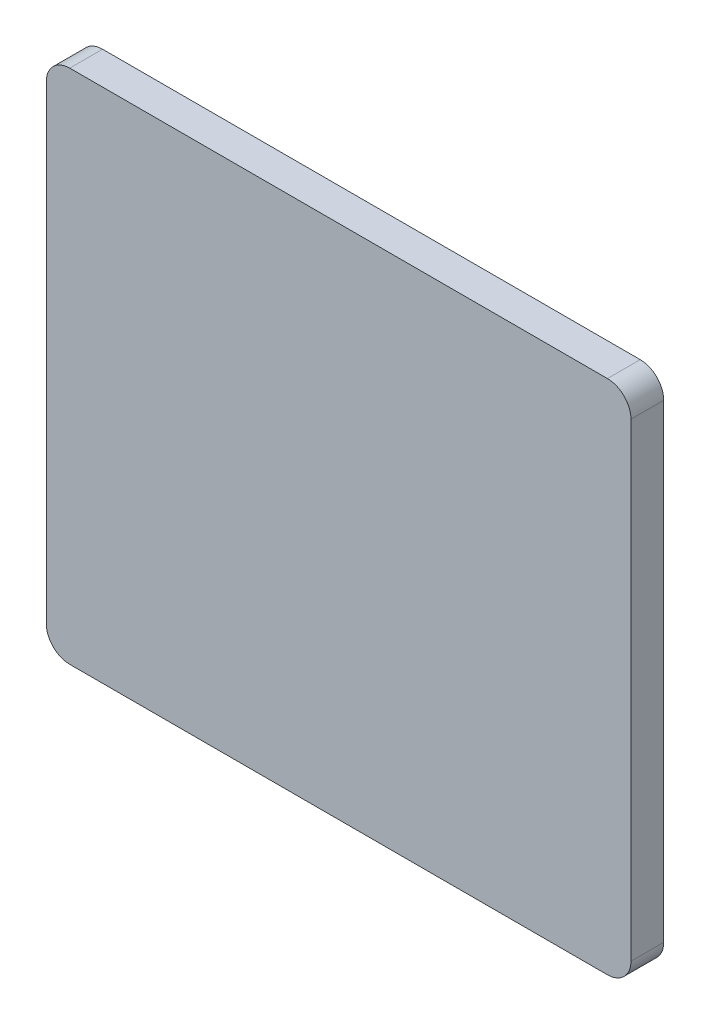
ISO-10303-21;
HEADER;
FILE_DESCRIPTION(('STEP AP214'),'2;1');
FILE_NAME('part.step','',(''),(''),'','','');
FILE_SCHEMA(('AUTOMOTIVE_DESIGN { 1 0 10303 214 1 1 1 1 }'));
ENDSEC;
DATA;
#1=APPLICATION_CONTEXT('core data for automotive mechanical design processes');
#2=APPLICATION_PROTOCOL_DEFINITION('international standard','automotive_design',2000,#1);
#3=PRODUCT_CONTEXT('',#1,'mechanical');
#4=PRODUCT('Part','Part','',(#3));
#5=PRODUCT_RELATED_PRODUCT_CATEGORY('part','',(#4));
#6=PRODUCT_DEFINITION_FORMATION('','',#4);
#7=PRODUCT_DEFINITION_CONTEXT('part definition',#1,'design');
#8=PRODUCT_DEFINITION('design','',#6,#7);
#9=PRODUCT_DEFINITION_SHAPE('','',#8);
#10=(LENGTH_UNIT() NAMED_UNIT(*) SI_UNIT(.MILLI.,.METRE.));
#11=(NAMED_UNIT(*) PLANE_ANGLE_UNIT() SI_UNIT($,.RADIAN.));
#12=(NAMED_UNIT(*) SI_UNIT($,.STERADIAN.) SOLID_ANGLE_UNIT());
#13=UNCERTAINTY_MEASURE_WITH_UNIT(LENGTH_MEASURE(1.E-05),#10,'distance_accuracy_value','');
#14=(GEOMETRIC_REPRESENTATION_CONTEXT(3) GLOBAL_UNCERTAINTY_ASSIGNED_CONTEXT((#13)) GLOBAL_UNIT_ASSIGNED_CONTEXT((#10,
#11,#12)) REPRESENTATION_CONTEXT('',''));
#15=CARTESIAN_POINT('',(0.,0.,0.));
#16=DIRECTION('',(0.,0.,1.));
#17=DIRECTION('',(1.,0.,0.));
#18=AXIS2_PLACEMENT_3D('',#15,#16,#17);
#19=CARTESIAN_POINT('',(-95.2,69.7,-1.));
#20=DIRECTION('',(0.,0.,1.));
#21=DIRECTION('',(1.,0.,0.));
#22=AXIS2_PLACEMENT_3D('',#19,#20,#21);
#23=CYLINDRICAL_SURFACE('',#22,4.3);
#24=CARTESIAN_POINT('',(-95.2,69.7,5.));
#25=DIRECTION('',(0.,0.,1.));
#26=DIRECTION('',(1.,0.,0.));
#27=AXIS2_PLACEMENT_3D('',#24,#25,#26);
#28=CIRCLE('',#27,4.3);
#29=CARTESIAN_POINT('',(-95.2,74.,5.));
#30=VERTEX_POINT('',#29);
#31=CARTESIAN_POINT('',(-99.5,69.7,5.));
#32=VERTEX_POINT('',#31);
#33=EDGE_CURVE('E137',#30,#32,#28,.T.);
#34=ORIENTED_EDGE('',*,*,#33,.F.);
#35=DIRECTION('',(0.,0.,1.));
#36=VECTOR('',#35,1.);
#37=CARTESIAN_POINT('',(-95.2,74.,-1.));
#38=LINE('',#37,#36);
#39=CARTESIAN_POINT('',(-95.2,74.,-1.));
#40=VERTEX_POINT('',#39);
#41=EDGE_CURVE('E11',#40,#30,#38,.T.);
#42=ORIENTED_EDGE('',*,*,#41,.F.);
#43=CARTESIAN_POINT('',(-95.2,69.7,-1.));
#44=DIRECTION('',(0.,0.,1.));
#45=DIRECTION('',(1.,0.,0.));
#46=AXIS2_PLACEMENT_3D('',#43,#44,#45);
#47=CIRCLE('',#46,4.3);
#48=CARTESIAN_POINT('',(-99.5,69.7,-1.));
#49=VERTEX_POINT('',#48);
#50=EDGE_CURVE('E157',#40,#49,#47,.T.);
#51=ORIENTED_EDGE('',*,*,#50,.T.);
#52=DIRECTION('',(0.,0.,1.));
#53=VECTOR('',#52,1.);
#54=CARTESIAN_POINT('',(-99.5,69.7,-1.));
#55=LINE('',#54,#53);
#56=EDGE_CURVE('E43',#49,#32,#55,.T.);
#57=ORIENTED_EDGE('',*,*,#56,.T.);
#58=EDGE_LOOP('',(#34,#42,#51,#57));
#59=FACE_BOUND('',#58,.T.);
#60=ADVANCED_FACE('F39',(#59),#23,.T.);
#61=CARTESIAN_POINT('',(3.2,74.,-1.));
#62=DIRECTION('',(0.,1.,0.));
#63=DIRECTION('',(-1.,0.,0.));
#64=AXIS2_PLACEMENT_3D('',#61,#62,#63);
#65=PLANE('',#64);
#66=DIRECTION('',(-1.,0.,0.));
#67=VECTOR('',#66,1.);
#68=CARTESIAN_POINT('',(3.2,74.,5.));
#69=LINE('',#68,#67);
#70=CARTESIAN_POINT('',(3.2,74.,5.));
#71=VERTEX_POINT('',#70);
#72=EDGE_CURVE('E155',#71,#30,#69,.T.);
#73=ORIENTED_EDGE('',*,*,#72,.F.);
#74=DIRECTION('',(0.,0.,1.));
#75=VECTOR('',#74,1.);
#76=CARTESIAN_POINT('',(3.2,74.,-1.));
#77=LINE('',#76,#75);
#78=CARTESIAN_POINT('',(3.2,74.,-1.));
#79=VERTEX_POINT('',#78);
#80=EDGE_CURVE('E49',#79,#71,#77,.T.);
#81=ORIENTED_EDGE('',*,*,#80,.F.);
#82=DIRECTION('',(-1.,0.,0.));
#83=VECTOR('',#82,1.);
#84=CARTESIAN_POINT('',(3.2,74.,-1.));
#85=LINE('',#84,#83);
#86=EDGE_CURVE('E127',#79,#40,#85,.T.);
#87=ORIENTED_EDGE('',*,*,#86,.T.);
#88=ORIENTED_EDGE('',*,*,#41,.T.);
#89=EDGE_LOOP('',(#73,#81,#87,#88));
#90=FACE_BOUND('',#89,.T.);
#91=ADVANCED_FACE('F168',(#90),#65,.T.);
#92=CARTESIAN_POINT('',(3.2,69.7,-1.));
#93=DIRECTION('',(0.,0.,1.));
#94=DIRECTION('',(1.,0.,0.));
#95=AXIS2_PLACEMENT_3D('',#92,#93,#94);
#96=CYLINDRICAL_SURFACE('',#95,4.30000000000001);
#97=CARTESIAN_POINT('',(3.2,69.7,5.));
#98=DIRECTION('',(0.,0.,1.));
#99=DIRECTION('',(1.,0.,0.));
#100=AXIS2_PLACEMENT_3D('',#97,#98,#99);
#101=CIRCLE('',#100,4.30000000000001);
#102=CARTESIAN_POINT('',(7.50000000000001,69.7,5.));
#103=VERTEX_POINT('',#102);
#104=EDGE_CURVE('E114',#103,#71,#101,.T.);
#105=ORIENTED_EDGE('',*,*,#104,.F.);
#106=DIRECTION('',(0.,0.,1.));
#107=VECTOR('',#106,1.);
#108=CARTESIAN_POINT('',(7.50000000000001,69.7,-1.));
#109=LINE('',#108,#107);
#110=CARTESIAN_POINT('',(7.50000000000001,69.7,-1.));
#111=VERTEX_POINT('',#110);
#112=EDGE_CURVE('E109',#111,#103,#109,.T.);
#113=ORIENTED_EDGE('',*,*,#112,.F.);
#114=CARTESIAN_POINT('',(3.2,69.7,-1.));
#115=DIRECTION('',(0.,0.,1.));
#116=DIRECTION('',(1.,0.,0.));
#117=AXIS2_PLACEMENT_3D('',#114,#115,#116);
#118=CIRCLE('',#117,4.30000000000001);
#119=EDGE_CURVE('E112',#111,#79,#118,.T.);
#120=ORIENTED_EDGE('',*,*,#119,.T.);
#121=ORIENTED_EDGE('',*,*,#80,.T.);
#122=EDGE_LOOP('',(#105,#113,#120,#121));
#123=FACE_BOUND('',#122,.T.);
#124=ADVANCED_FACE('F111',(#123),#96,.T.);
#125=CARTESIAN_POINT('',(7.5,-16.2,-1.));
#126=DIRECTION('',(1.,0.,0.));
#127=DIRECTION('',(0.,1.,0.));
#128=AXIS2_PLACEMENT_3D('',#125,#126,#127);
#129=PLANE('',#128);
#130=DIRECTION('',(0.,1.,0.));
#131=VECTOR('',#130,1.);
#132=CARTESIAN_POINT('',(7.5,-16.2,5.));
#133=LINE('',#132,#131);
#134=CARTESIAN_POINT('',(7.5,-16.2,5.));
#135=VERTEX_POINT('',#134);
#136=EDGE_CURVE('E152',#135,#103,#133,.T.);
#137=ORIENTED_EDGE('',*,*,#136,.F.);
#138=DIRECTION('',(0.,0.,1.));
#139=VECTOR('',#138,1.);
#140=CARTESIAN_POINT('',(7.5,-16.2,-1.));
#141=LINE('',#140,#139);
#142=CARTESIAN_POINT('',(7.5,-16.2,-1.));
#143=VERTEX_POINT('',#142);
#144=EDGE_CURVE('E119',#143,#135,#141,.T.);
#145=ORIENTED_EDGE('',*,*,#144,.F.);
#146=DIRECTION('',(0.,1.,0.));
#147=VECTOR('',#146,1.);
#148=CARTESIAN_POINT('',(7.5,-16.2,-1.));
#149=LINE('',#148,#147);
#150=EDGE_CURVE('E125',#143,#111,#149,.T.);
#151=ORIENTED_EDGE('',*,*,#150,.T.);
#152=ORIENTED_EDGE('',*,*,#112,.T.);
#153=EDGE_LOOP('',(#137,#145,#151,#152));
#154=FACE_BOUND('',#153,.T.);
#155=ADVANCED_FACE('F129',(#154),#129,.T.);
#156=CARTESIAN_POINT('',(3.2,-16.2,-1.));
#157=DIRECTION('',(0.,0.,1.));
#158=DIRECTION('',(1.,0.,0.));
#159=AXIS2_PLACEMENT_3D('',#156,#157,#158);
#160=CYLINDRICAL_SURFACE('',#159,4.3);
#161=CARTESIAN_POINT('',(3.2,-16.2,5.));
#162=DIRECTION('',(0.,0.,1.));
#163=DIRECTION('',(1.,0.,0.));
#164=AXIS2_PLACEMENT_3D('',#161,#162,#163);
#165=CIRCLE('',#164,4.3);
#166=CARTESIAN_POINT('',(3.19999999999999,-20.5,5.));
#167=VERTEX_POINT('',#166);
#168=EDGE_CURVE('E149',#167,#135,#165,.T.);
#169=ORIENTED_EDGE('',*,*,#168,.F.);
#170=DIRECTION('',(0.,0.,1.));
#171=VECTOR('',#170,1.);
#172=CARTESIAN_POINT('',(3.19999999999999,-20.5,-1.));
#173=LINE('',#172,#171);
#174=CARTESIAN_POINT('',(3.19999999999999,-20.5,-1.));
#175=VERTEX_POINT('',#174);
#176=EDGE_CURVE('E161',#175,#167,#173,.T.);
#177=ORIENTED_EDGE('',*,*,#176,.F.);
#178=CARTESIAN_POINT('',(3.2,-16.2,-1.));
#179=DIRECTION('',(0.,0.,1.));
#180=DIRECTION('',(1.,0.,0.));
#181=AXIS2_PLACEMENT_3D('',#178,#179,#180);
#182=CIRCLE('',#181,4.3);
#183=EDGE_CURVE('E130',#175,#143,#182,.T.);
#184=ORIENTED_EDGE('',*,*,#183,.T.);
#185=ORIENTED_EDGE('',*,*,#144,.T.);
#186=EDGE_LOOP('',(#169,#177,#184,#185));
#187=FACE_BOUND('',#186,.T.);
#188=ADVANCED_FACE('F180',(#187),#160,.T.);
#189=CARTESIAN_POINT('',(-95.2,-20.5,-1.));
#190=DIRECTION('',(0.,-1.,0.));
#191=DIRECTION('',(1.,0.,0.));
#192=AXIS2_PLACEMENT_3D('',#189,#190,#191);
#193=PLANE('',#192);
#194=DIRECTION('',(1.,0.,0.));
#195=VECTOR('',#194,1.);
#196=CARTESIAN_POINT('',(-95.2,-20.5,5.));
#197=LINE('',#196,#195);
#198=CARTESIAN_POINT('',(-95.2,-20.5,5.));
#199=VERTEX_POINT('',#198);
#200=EDGE_CURVE('E146',#199,#167,#197,.T.);
#201=ORIENTED_EDGE('',*,*,#200,.F.);
#202=DIRECTION('',(0.,0.,1.));
#203=VECTOR('',#202,1.);
#204=CARTESIAN_POINT('',(-95.2,-20.5,-1.));
#205=LINE('',#204,#203);
#206=CARTESIAN_POINT('',(-95.2,-20.5,-1.));
#207=VERTEX_POINT('',#206);
#208=EDGE_CURVE('E163',#207,#199,#205,.T.);
#209=ORIENTED_EDGE('',*,*,#208,.F.);
#210=DIRECTION('',(1.,0.,0.));
#211=VECTOR('',#210,1.);
#212=CARTESIAN_POINT('',(-95.2,-20.5,-1.));
#213=LINE('',#212,#211);
#214=EDGE_CURVE('E132',#207,#175,#213,.T.);
#215=ORIENTED_EDGE('',*,*,#214,.T.);
#216=ORIENTED_EDGE('',*,*,#176,.T.);
#217=EDGE_LOOP('',(#201,#209,#215,#216));
#218=FACE_BOUND('',#217,.T.);
#219=ADVANCED_FACE('F183',(#218),#193,.T.);
#220=CARTESIAN_POINT('',(-95.2,-16.2,-1.));
#221=DIRECTION('',(0.,0.,1.));
#222=DIRECTION('',(1.,0.,0.));
#223=AXIS2_PLACEMENT_3D('',#220,#221,#222);
#224=CYLINDRICAL_SURFACE('',#223,4.3);
#225=CARTESIAN_POINT('',(-95.2,-16.2,5.));
#226=DIRECTION('',(0.,0.,1.));
#227=DIRECTION('',(1.,0.,0.));
#228=AXIS2_PLACEMENT_3D('',#225,#226,#227);
#229=CIRCLE('',#228,4.3);
#230=CARTESIAN_POINT('',(-99.5,-16.2,5.));
#231=VERTEX_POINT('',#230);
#232=EDGE_CURVE('E143',#231,#199,#229,.T.);
#233=ORIENTED_EDGE('',*,*,#232,.F.);
#234=DIRECTION('',(0.,0.,1.));
#235=VECTOR('',#234,1.);
#236=CARTESIAN_POINT('',(-99.5,-16.2,-1.));
#237=LINE('',#236,#235);
#238=CARTESIAN_POINT('',(-99.5,-16.2,-1.));
#239=VERTEX_POINT('',#238);
#240=EDGE_CURVE('E164',#239,#231,#237,.T.);
#241=ORIENTED_EDGE('',*,*,#240,.F.);
#242=CARTESIAN_POINT('',(-95.2,-16.2,-1.));
#243=DIRECTION('',(0.,0.,1.));
#244=DIRECTION('',(1.,0.,0.));
#245=AXIS2_PLACEMENT_3D('',#242,#243,#244);
#246=CIRCLE('',#245,4.3);
#247=EDGE_CURVE('E262',#239,#207,#246,.T.);
#248=ORIENTED_EDGE('',*,*,#247,.T.);
#249=ORIENTED_EDGE('',*,*,#208,.T.);
#250=EDGE_LOOP('',(#233,#241,#248,#249));
#251=FACE_BOUND('',#250,.T.);
#252=ADVANCED_FACE('F187',(#251),#224,.T.);
#253=CARTESIAN_POINT('',(-99.5,69.7,-1.));
#254=DIRECTION('',(-1.,0.,0.));
#255=DIRECTION('',(0.,0.,1.));
#256=AXIS2_PLACEMENT_3D('',#253,#254,#255);
#257=PLANE('',#256);
#258=DIRECTION('',(0.,-1.,0.));
#259=VECTOR('',#258,1.);
#260=CARTESIAN_POINT('',(-99.5,69.7,5.));
#261=LINE('',#260,#259);
#262=EDGE_CURVE('E140',#32,#231,#261,.T.);
#263=ORIENTED_EDGE('',*,*,#262,.F.);
#264=ORIENTED_EDGE('',*,*,#56,.F.);
#265=DIRECTION('',(0.,-1.,0.));
#266=VECTOR('',#265,1.);
#267=CARTESIAN_POINT('',(-99.5,69.7,-1.));
#268=LINE('',#267,#266);
#269=EDGE_CURVE('E263',#49,#239,#268,.T.);
#270=ORIENTED_EDGE('',*,*,#269,.T.);
#271=ORIENTED_EDGE('',*,*,#240,.T.);
#272=EDGE_LOOP('',(#263,#264,#270,#271));
#273=FACE_BOUND('',#272,.T.);
#274=ADVANCED_FACE('F166',(#273),#257,.T.);
#275=CARTESIAN_POINT('',(-95.2,69.7,-1.));
#276=DIRECTION('',(0.,0.,1.));
#277=DIRECTION('',(1.,0.,0.));
#278=AXIS2_PLACEMENT_3D('',#275,#276,#277);
#279=PLANE('',#278);
#280=ORIENTED_EDGE('',*,*,#50,.F.);
#281=ORIENTED_EDGE('',*,*,#86,.F.);
#282=ORIENTED_EDGE('',*,*,#119,.F.);
#283=ORIENTED_EDGE('',*,*,#150,.F.);
#284=ORIENTED_EDGE('',*,*,#183,.F.);
#285=ORIENTED_EDGE('',*,*,#214,.F.);
#286=ORIENTED_EDGE('',*,*,#247,.F.);
#287=ORIENTED_EDGE('',*,*,#269,.F.);
#288=EDGE_LOOP('',(#280,#281,#282,#283,#284,#285,#286,#287));
#289=FACE_BOUND('',#288,.T.);
#290=ADVANCED_FACE('F123',(#289),#279,.F.);
#291=CARTESIAN_POINT('',(-95.2,69.7,5.));
#292=DIRECTION('',(0.,0.,1.));
#293=DIRECTION('',(1.,0.,0.));
#294=AXIS2_PLACEMENT_3D('',#291,#292,#293);
#295=PLANE('',#294);
#296=ORIENTED_EDGE('',*,*,#33,.T.);
#297=ORIENTED_EDGE('',*,*,#262,.T.);
#298=ORIENTED_EDGE('',*,*,#232,.T.);
#299=ORIENTED_EDGE('',*,*,#200,.T.);
#300=ORIENTED_EDGE('',*,*,#168,.T.);
#301=ORIENTED_EDGE('',*,*,#136,.T.);
#302=ORIENTED_EDGE('',*,*,#104,.T.);
#303=ORIENTED_EDGE('',*,*,#72,.T.);
#304=EDGE_LOOP('',(#296,#297,#298,#299,#300,#301,#302,#303));
#305=FACE_BOUND('',#304,.T.);
#306=ADVANCED_FACE('F41',(#305),#295,.T.);
#307=CLOSED_SHELL('',(#60,#91,#124,#155,#188,#219,#252,#274,#290,#306));
#308=MANIFOLD_SOLID_BREP('B2',#307);
#309=ADVANCED_BREP_SHAPE_REPRESENTATION('',(#18,#308),#14);
#310=SHAPE_DEFINITION_REPRESENTATION(#9,#309);
ENDSEC;
END-ISO-10303-21;
